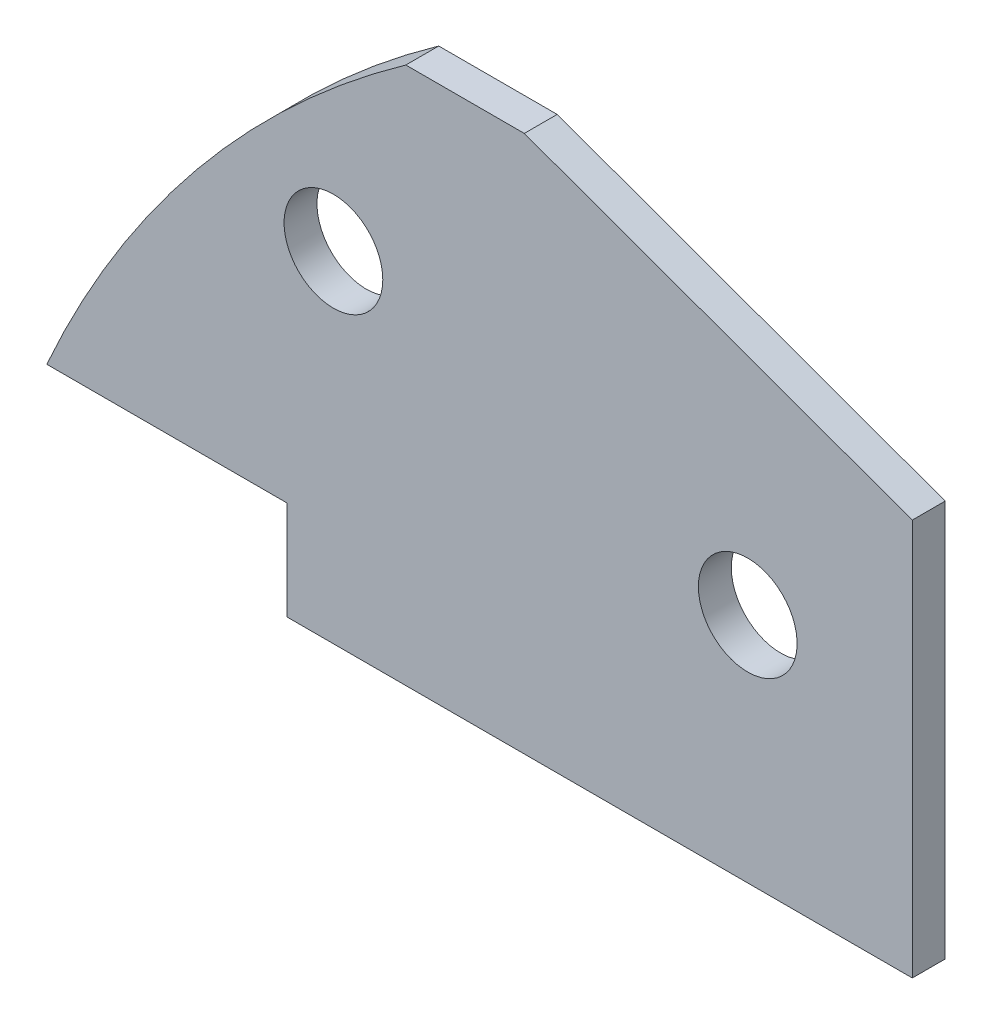
ISO-10303-21;
HEADER;
FILE_DESCRIPTION(('STEP AP214'),'2;1');
FILE_NAME('part.step','',(''),(''),'','','');
FILE_SCHEMA(('AUTOMOTIVE_DESIGN { 1 0 10303 214 1 1 1 1 }'));
ENDSEC;
DATA;
#1=APPLICATION_CONTEXT('core data for automotive mechanical design processes');
#2=APPLICATION_PROTOCOL_DEFINITION('international standard','automotive_design',2000,#1);
#3=PRODUCT_CONTEXT('',#1,'mechanical');
#4=PRODUCT('Part','Part','',(#3));
#5=PRODUCT_RELATED_PRODUCT_CATEGORY('part','',(#4));
#6=PRODUCT_DEFINITION_FORMATION('','',#4);
#7=PRODUCT_DEFINITION_CONTEXT('part definition',#1,'design');
#8=PRODUCT_DEFINITION('design','',#6,#7);
#9=PRODUCT_DEFINITION_SHAPE('','',#8);
#10=(LENGTH_UNIT() NAMED_UNIT(*) SI_UNIT(.MILLI.,.METRE.));
#11=(NAMED_UNIT(*) PLANE_ANGLE_UNIT() SI_UNIT($,.RADIAN.));
#12=(NAMED_UNIT(*) SI_UNIT($,.STERADIAN.) SOLID_ANGLE_UNIT());
#13=UNCERTAINTY_MEASURE_WITH_UNIT(LENGTH_MEASURE(1.E-05),#10,'distance_accuracy_value','');
#14=(GEOMETRIC_REPRESENTATION_CONTEXT(3) GLOBAL_UNCERTAINTY_ASSIGNED_CONTEXT((#13)) GLOBAL_UNIT_ASSIGNED_CONTEXT((#10,
#11,#12)) REPRESENTATION_CONTEXT('',''));
#15=CARTESIAN_POINT('',(0.,0.,0.));
#16=DIRECTION('',(0.,0.,1.));
#17=DIRECTION('',(1.,0.,0.));
#18=AXIS2_PLACEMENT_3D('',#15,#16,#17);
#19=CARTESIAN_POINT('',(0.,0.,0.));
#20=DIRECTION('',(0.,0.,1.));
#21=DIRECTION('',(1.,0.,0.));
#22=AXIS2_PLACEMENT_3D('',#19,#20,#21);
#23=PLANE('',#22);
#24=CARTESIAN_POINT('',(-16.,20.5,0.));
#25=DIRECTION('',(0.,0.,-1.));
#26=DIRECTION('',(-1.,0.,0.));
#27=AXIS2_PLACEMENT_3D('',#24,#25,#26);
#28=CIRCLE('',#27,1.5);
#29=CARTESIAN_POINT('',(-17.5,20.5,0.));
#30=VERTEX_POINT('',#29);
#31=EDGE_CURVE('E165',#30,#30,#28,.T.);
#32=ORIENTED_EDGE('',*,*,#31,.F.);
#33=EDGE_LOOP('',(#32));
#34=FACE_BOUND('',#33,.T.);
#35=CARTESIAN_POINT('',(-28.5900387108147,23.7802641955972,0.));
#36=DIRECTION('',(0.,0.,1.));
#37=DIRECTION('',(1.,0.,0.));
#38=AXIS2_PLACEMENT_3D('',#35,#36,#37);
#39=CIRCLE('',#38,1.5);
#40=CARTESIAN_POINT('',(-27.0900387108147,23.7802641955972,0.));
#41=VERTEX_POINT('',#40);
#42=EDGE_CURVE('E157',#41,#41,#39,.T.);
#43=ORIENTED_EDGE('',*,*,#42,.T.);
#44=EDGE_LOOP('',(#43));
#45=FACE_BOUND('',#44,.T.);
#46=DIRECTION('',(-0.939973110395639,0.341248519019714,0.));
#47=VECTOR('',#46,1.);
#48=CARTESIAN_POINT('',(6.89853694287745,19.0021021805552,0.));
#49=LINE('',#48,#47);
#50=CARTESIAN_POINT('',(-11.,25.5,0.));
#51=VERTEX_POINT('',#50);
#52=CARTESIAN_POINT('',(-22.7900387108147,29.7802641955972,0.));
#53=VERTEX_POINT('',#52);
#54=EDGE_CURVE('E98',#51,#53,#49,.T.);
#55=ORIENTED_EDGE('',*,*,#54,.F.);
#56=DIRECTION('',(0.,1.,0.));
#57=VECTOR('',#56,1.);
#58=CARTESIAN_POINT('',(-11.,25.5,0.));
#59=LINE('',#58,#57);
#60=CARTESIAN_POINT('',(-11.,13.4492983568228,0.));
#61=VERTEX_POINT('',#60);
#62=EDGE_CURVE('E94',#61,#51,#59,.T.);
#63=ORIENTED_EDGE('',*,*,#62,.F.);
#64=DIRECTION('',(-1.,0.,0.));
#65=VECTOR('',#64,1.);
#66=CARTESIAN_POINT('',(-30.,13.4492983568228,0.));
#67=LINE('',#66,#65);
#68=CARTESIAN_POINT('',(-30.,13.4492983568228,0.));
#69=VERTEX_POINT('',#68);
#70=EDGE_CURVE('E153',#61,#69,#67,.T.);
#71=ORIENTED_EDGE('',*,*,#70,.T.);
#72=DIRECTION('',(0.,1.,0.));
#73=VECTOR('',#72,1.);
#74=CARTESIAN_POINT('',(-30.,16.4492983568228,0.));
#75=LINE('',#74,#73);
#76=CARTESIAN_POINT('',(-30.,16.4492983568228,0.));
#77=VERTEX_POINT('',#76);
#78=EDGE_CURVE('E126',#69,#77,#75,.T.);
#79=ORIENTED_EDGE('',*,*,#78,.T.);
#80=DIRECTION('',(-1.,0.,0.));
#81=VECTOR('',#80,1.);
#82=CARTESIAN_POINT('',(0.,16.4492983568228,0.));
#83=LINE('',#82,#81);
#84=CARTESIAN_POINT('',(-37.299711921146,16.4492983568228,0.));
#85=VERTEX_POINT('',#84);
#86=EDGE_CURVE('E133',#77,#85,#83,.T.);
#87=ORIENTED_EDGE('',*,*,#86,.T.);
#88=CARTESIAN_POINT('',(-7.61252759266184,3.28373542568487,0.));
#89=DIRECTION('',(0.,0.,1.));
#90=DIRECTION('',(-1.,0.,0.));
#91=AXIS2_PLACEMENT_3D('',#88,#89,#90);
#92=CIRCLE('',#91,32.4755440392789);
#93=CARTESIAN_POINT('',(-26.3900387108147,29.7802641955972,0.));
#94=VERTEX_POINT('',#93);
#95=EDGE_CURVE('E119',#94,#85,#92,.T.);
#96=ORIENTED_EDGE('',*,*,#95,.F.);
#97=DIRECTION('',(-1.,0.,0.));
#98=VECTOR('',#97,1.);
#99=CARTESIAN_POINT('',(-22.7900387108147,29.7802641955972,0.));
#100=LINE('',#99,#98);
#101=EDGE_CURVE('E117',#53,#94,#100,.T.);
#102=ORIENTED_EDGE('',*,*,#101,.F.);
#103=EDGE_LOOP('',(#55,#63,#71,#79,#87,#96,#102));
#104=FACE_BOUND('',#103,.T.);
#105=ADVANCED_FACE('F34',(#34,#45,#104),#23,.F.);
#106=CARTESIAN_POINT('',(6.89853694287745,19.0021021805552,3.));
#107=DIRECTION('',(-0.341248519019714,-0.939973110395639,0.));
#108=DIRECTION('',(0.939973110395639,-0.341248519019714,0.));
#109=AXIS2_PLACEMENT_3D('',#106,#107,#108);
#110=PLANE('',#109);
#111=DIRECTION('',(0.,0.,-1.));
#112=VECTOR('',#111,1.);
#113=CARTESIAN_POINT('',(-22.7900387108147,29.7802641955972,3.));
#114=LINE('',#113,#112);
#115=CARTESIAN_POINT('',(-22.7900387108147,29.7802641955972,1.));
#116=VERTEX_POINT('',#115);
#117=EDGE_CURVE('E11',#116,#53,#114,.T.);
#118=ORIENTED_EDGE('',*,*,#117,.F.);
#119=DIRECTION('',(-0.939973110395639,0.341248519019714,0.));
#120=VECTOR('',#119,1.);
#121=CARTESIAN_POINT('',(-22.7900387108147,29.7802641955972,1.));
#122=LINE('',#121,#120);
#123=CARTESIAN_POINT('',(-11.,25.5,1.));
#124=VERTEX_POINT('',#123);
#125=EDGE_CURVE('E103',#124,#116,#122,.T.);
#126=ORIENTED_EDGE('',*,*,#125,.F.);
#127=DIRECTION('',(0.,0.,-1.));
#128=VECTOR('',#127,1.);
#129=CARTESIAN_POINT('',(-11.,25.5,3.));
#130=LINE('',#129,#128);
#131=EDGE_CURVE('E43',#124,#51,#130,.T.);
#132=ORIENTED_EDGE('',*,*,#131,.T.);
#133=ORIENTED_EDGE('',*,*,#54,.T.);
#134=EDGE_LOOP('',(#118,#126,#132,#133));
#135=FACE_BOUND('',#134,.T.);
#136=ADVANCED_FACE('F36',(#135),#110,.F.);
#137=CARTESIAN_POINT('',(0.,16.4492983568228,0.));
#138=DIRECTION('',(0.,1.,0.));
#139=DIRECTION('',(0.,0.,1.));
#140=AXIS2_PLACEMENT_3D('',#137,#138,#139);
#141=PLANE('',#140);
#142=DIRECTION('',(0.,0.,1.));
#143=VECTOR('',#142,1.);
#144=CARTESIAN_POINT('',(-30.,16.4492983568228,0.));
#145=LINE('',#144,#143);
#146=CARTESIAN_POINT('',(-30.,16.4492983568228,1.));
#147=VERTEX_POINT('',#146);
#148=EDGE_CURVE('E130',#77,#147,#145,.T.);
#149=ORIENTED_EDGE('',*,*,#148,.T.);
#150=DIRECTION('',(1.,0.,0.));
#151=VECTOR('',#150,1.);
#152=CARTESIAN_POINT('',(-30.,16.4492983568228,1.));
#153=LINE('',#152,#151);
#154=CARTESIAN_POINT('',(-37.299711921146,16.4492983568228,1.));
#155=VERTEX_POINT('',#154);
#156=EDGE_CURVE('E144',#155,#147,#153,.T.);
#157=ORIENTED_EDGE('',*,*,#156,.F.);
#158=DIRECTION('',(0.,0.,1.));
#159=VECTOR('',#158,1.);
#160=CARTESIAN_POINT('',(-37.299711921146,16.4492983568228,0.));
#161=LINE('',#160,#159);
#162=EDGE_CURVE('E123',#85,#155,#161,.T.);
#163=ORIENTED_EDGE('',*,*,#162,.F.);
#164=ORIENTED_EDGE('',*,*,#86,.F.);
#165=EDGE_LOOP('',(#149,#157,#163,#164));
#166=FACE_BOUND('',#165,.T.);
#167=ADVANCED_FACE('F147',(#166),#141,.F.);
#168=CARTESIAN_POINT('',(-30.,16.4492983568228,0.));
#169=DIRECTION('',(1.,0.,0.));
#170=DIRECTION('',(0.,1.,0.));
#171=AXIS2_PLACEMENT_3D('',#168,#169,#170);
#172=PLANE('',#171);
#173=ORIENTED_EDGE('',*,*,#78,.F.);
#174=DIRECTION('',(0.,0.,1.));
#175=VECTOR('',#174,1.);
#176=CARTESIAN_POINT('',(-30.,13.4492983568228,0.));
#177=LINE('',#176,#175);
#178=CARTESIAN_POINT('',(-30.,13.4492983568228,1.));
#179=VERTEX_POINT('',#178);
#180=EDGE_CURVE('E150',#69,#179,#177,.T.);
#181=ORIENTED_EDGE('',*,*,#180,.T.);
#182=DIRECTION('',(0.,-1.,0.));
#183=VECTOR('',#182,1.);
#184=CARTESIAN_POINT('',(-30.,16.4492983568228,1.));
#185=LINE('',#184,#183);
#186=EDGE_CURVE('E112',#147,#179,#185,.T.);
#187=ORIENTED_EDGE('',*,*,#186,.F.);
#188=ORIENTED_EDGE('',*,*,#148,.F.);
#189=EDGE_LOOP('',(#173,#181,#187,#188));
#190=FACE_BOUND('',#189,.T.);
#191=ADVANCED_FACE('F191',(#190),#172,.F.);
#192=CARTESIAN_POINT('',(-7.61252759266184,3.28373542568487,0.));
#193=DIRECTION('',(0.,0.,1.));
#194=DIRECTION('',(1.,0.,0.));
#195=AXIS2_PLACEMENT_3D('',#192,#193,#194);
#196=CYLINDRICAL_SURFACE('',#195,32.4755440392789);
#197=CARTESIAN_POINT('',(-7.61252759266062,3.28373542568388,1.));
#198=DIRECTION('',(0.,0.,1.));
#199=DIRECTION('',(-1.,0.,0.));
#200=AXIS2_PLACEMENT_3D('',#197,#198,#199);
#201=CIRCLE('',#200,32.4755440392804);
#202=CARTESIAN_POINT('',(-26.3900387108147,29.7802641955972,1.));
#203=VERTEX_POINT('',#202);
#204=EDGE_CURVE('E110',#203,#155,#201,.T.);
#205=ORIENTED_EDGE('',*,*,#204,.F.);
#206=DIRECTION('',(0.,0.,1.));
#207=VECTOR('',#206,1.);
#208=CARTESIAN_POINT('',(-26.3900387108147,29.7802641955972,0.));
#209=LINE('',#208,#207);
#210=EDGE_CURVE('E122',#94,#203,#209,.T.);
#211=ORIENTED_EDGE('',*,*,#210,.F.);
#212=ORIENTED_EDGE('',*,*,#95,.T.);
#213=ORIENTED_EDGE('',*,*,#162,.T.);
#214=EDGE_LOOP('',(#205,#211,#212,#213));
#215=FACE_BOUND('',#214,.T.);
#216=ADVANCED_FACE('F141',(#215),#196,.T.);
#217=CARTESIAN_POINT('',(-22.7900387108147,29.7802641955972,0.));
#218=DIRECTION('',(0.,1.,0.));
#219=DIRECTION('',(0.,0.,1.));
#220=AXIS2_PLACEMENT_3D('',#217,#218,#219);
#221=PLANE('',#220);
#222=DIRECTION('',(-1.,0.,0.));
#223=VECTOR('',#222,1.);
#224=CARTESIAN_POINT('',(-26.3900387108147,29.7802641955972,1.));
#225=LINE('',#224,#223);
#226=EDGE_CURVE('E108',#116,#203,#225,.T.);
#227=ORIENTED_EDGE('',*,*,#226,.F.);
#228=ORIENTED_EDGE('',*,*,#117,.T.);
#229=ORIENTED_EDGE('',*,*,#101,.T.);
#230=ORIENTED_EDGE('',*,*,#210,.T.);
#231=EDGE_LOOP('',(#227,#228,#229,#230));
#232=FACE_BOUND('',#231,.T.);
#233=ADVANCED_FACE('F138',(#232),#221,.T.);
#234=CARTESIAN_POINT('',(-7.61252759266062,3.28373542568388,1.));
#235=DIRECTION('',(0.,0.,-1.));
#236=DIRECTION('',(-1.,0.,0.));
#237=AXIS2_PLACEMENT_3D('',#234,#235,#236);
#238=PLANE('',#237);
#239=CARTESIAN_POINT('',(-16.,20.5,0.999999999999999));
#240=DIRECTION('',(0.,0.,-1.));
#241=DIRECTION('',(-1.,0.,0.));
#242=AXIS2_PLACEMENT_3D('',#239,#240,#241);
#243=CIRCLE('',#242,1.5);
#244=CARTESIAN_POINT('',(-17.5,20.5,0.999999999999999));
#245=VERTEX_POINT('',#244);
#246=EDGE_CURVE('E38',#245,#245,#243,.T.);
#247=ORIENTED_EDGE('',*,*,#246,.T.);
#248=EDGE_LOOP('',(#247));
#249=FACE_BOUND('',#248,.T.);
#250=CARTESIAN_POINT('',(-28.5900387108147,23.7802641955972,1.));
#251=DIRECTION('',(0.,0.,1.));
#252=DIRECTION('',(1.,0.,0.));
#253=AXIS2_PLACEMENT_3D('',#250,#251,#252);
#254=CIRCLE('',#253,1.5);
#255=CARTESIAN_POINT('',(-27.0900387108147,23.7802641955972,1.));
#256=VERTEX_POINT('',#255);
#257=EDGE_CURVE('E158',#256,#256,#254,.T.);
#258=ORIENTED_EDGE('',*,*,#257,.F.);
#259=EDGE_LOOP('',(#258));
#260=FACE_BOUND('',#259,.T.);
#261=DIRECTION('',(1.,0.,0.));
#262=VECTOR('',#261,1.);
#263=CARTESIAN_POINT('',(-30.,13.4492983568228,1.));
#264=LINE('',#263,#262);
#265=CARTESIAN_POINT('',(-11.,13.4492983568228,1.));
#266=VERTEX_POINT('',#265);
#267=EDGE_CURVE('E105',#179,#266,#264,.T.);
#268=ORIENTED_EDGE('',*,*,#267,.T.);
#269=DIRECTION('',(0.,1.,0.));
#270=VECTOR('',#269,1.);
#271=CARTESIAN_POINT('',(-11.,25.5,1.));
#272=LINE('',#271,#270);
#273=EDGE_CURVE('E50',#266,#124,#272,.T.);
#274=ORIENTED_EDGE('',*,*,#273,.T.);
#275=ORIENTED_EDGE('',*,*,#125,.T.);
#276=ORIENTED_EDGE('',*,*,#226,.T.);
#277=ORIENTED_EDGE('',*,*,#204,.T.);
#278=ORIENTED_EDGE('',*,*,#156,.T.);
#279=ORIENTED_EDGE('',*,*,#186,.T.);
#280=EDGE_LOOP('',(#268,#274,#275,#276,#277,#278,#279));
#281=FACE_BOUND('',#280,.T.);
#282=ADVANCED_FACE('F102',(#249,#260,#281),#238,.F.);
#283=CARTESIAN_POINT('',(-30.,13.4492983568228,0.));
#284=DIRECTION('',(0.,1.,0.));
#285=DIRECTION('',(0.,0.,1.));
#286=AXIS2_PLACEMENT_3D('',#283,#284,#285);
#287=PLANE('',#286);
#288=ORIENTED_EDGE('',*,*,#70,.F.);
#289=DIRECTION('',(0.,0.,-1.));
#290=VECTOR('',#289,1.);
#291=CARTESIAN_POINT('',(-11.,13.4492983568228,1.));
#292=LINE('',#291,#290);
#293=EDGE_CURVE('E106',#266,#61,#292,.T.);
#294=ORIENTED_EDGE('',*,*,#293,.F.);
#295=ORIENTED_EDGE('',*,*,#267,.F.);
#296=ORIENTED_EDGE('',*,*,#180,.F.);
#297=EDGE_LOOP('',(#288,#294,#295,#296));
#298=FACE_BOUND('',#297,.T.);
#299=ADVANCED_FACE('F201',(#298),#287,.F.);
#300=CARTESIAN_POINT('',(-28.5900387108147,23.7802641955972,0.));
#301=DIRECTION('',(0.,0.,1.));
#302=DIRECTION('',(1.,0.,0.));
#303=AXIS2_PLACEMENT_3D('',#300,#301,#302);
#304=CYLINDRICAL_SURFACE('',#303,1.5);
#305=ORIENTED_EDGE('',*,*,#42,.F.);
#306=EDGE_LOOP('',(#305));
#307=FACE_BOUND('',#306,.T.);
#308=ORIENTED_EDGE('',*,*,#257,.T.);
#309=EDGE_LOOP('',(#308));
#310=FACE_BOUND('',#309,.T.);
#311=ADVANCED_FACE('F180',(#307,#310),#304,.F.);
#312=CARTESIAN_POINT('',(-11.,25.5,1.));
#313=DIRECTION('',(-1.,0.,0.));
#314=DIRECTION('',(0.,-1.,0.));
#315=AXIS2_PLACEMENT_3D('',#312,#313,#314);
#316=PLANE('',#315);
#317=ORIENTED_EDGE('',*,*,#62,.T.);
#318=ORIENTED_EDGE('',*,*,#131,.F.);
#319=ORIENTED_EDGE('',*,*,#273,.F.);
#320=ORIENTED_EDGE('',*,*,#293,.T.);
#321=EDGE_LOOP('',(#317,#318,#319,#320));
#322=FACE_BOUND('',#321,.T.);
#323=ADVANCED_FACE('F92',(#322),#316,.F.);
#324=CARTESIAN_POINT('',(-16.,20.5,10.));
#325=DIRECTION('',(0.,0.,-1.));
#326=DIRECTION('',(-1.,0.,0.));
#327=AXIS2_PLACEMENT_3D('',#324,#325,#326);
#328=CYLINDRICAL_SURFACE('',#327,1.5);
#329=ORIENTED_EDGE('',*,*,#31,.T.);
#330=EDGE_LOOP('',(#329));
#331=FACE_BOUND('',#330,.T.);
#332=ORIENTED_EDGE('',*,*,#246,.F.);
#333=EDGE_LOOP('',(#332));
#334=FACE_BOUND('',#333,.T.);
#335=ADVANCED_FACE('F174',(#331,#334),#328,.F.);
#336=CLOSED_SHELL('',(#105,#136,#167,#191,#216,#233,#282,#299,#311,#323,#335));
#337=MANIFOLD_SOLID_BREP('B2',#336);
#338=ADVANCED_BREP_SHAPE_REPRESENTATION('',(#18,#337),#14);
#339=SHAPE_DEFINITION_REPRESENTATION(#9,#338);
ENDSEC;
END-ISO-10303-21;
